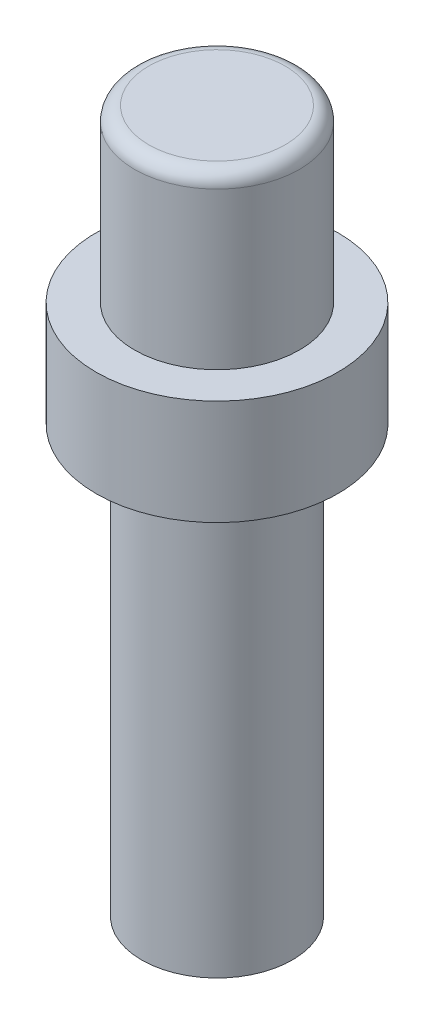
ISO-10303-21;
HEADER;
FILE_DESCRIPTION(('STEP AP214'),'2;1');
FILE_NAME('part.step','',(''),(''),'','','');
FILE_SCHEMA(('AUTOMOTIVE_DESIGN { 1 0 10303 214 1 1 1 1 }'));
ENDSEC;
DATA;
#1=APPLICATION_CONTEXT('core data for automotive mechanical design processes');
#2=APPLICATION_PROTOCOL_DEFINITION('international standard','automotive_design',2000,#1);
#3=PRODUCT_CONTEXT('',#1,'mechanical');
#4=PRODUCT('Part','Part','',(#3));
#5=PRODUCT_RELATED_PRODUCT_CATEGORY('part','',(#4));
#6=PRODUCT_DEFINITION_FORMATION('','',#4);
#7=PRODUCT_DEFINITION_CONTEXT('part definition',#1,'design');
#8=PRODUCT_DEFINITION('design','',#6,#7);
#9=PRODUCT_DEFINITION_SHAPE('','',#8);
#10=(LENGTH_UNIT() NAMED_UNIT(*) SI_UNIT(.MILLI.,.METRE.));
#11=(NAMED_UNIT(*) PLANE_ANGLE_UNIT() SI_UNIT($,.RADIAN.));
#12=(NAMED_UNIT(*) SI_UNIT($,.STERADIAN.) SOLID_ANGLE_UNIT());
#13=UNCERTAINTY_MEASURE_WITH_UNIT(LENGTH_MEASURE(1.E-05),#10,'distance_accuracy_value','');
#14=(GEOMETRIC_REPRESENTATION_CONTEXT(3) GLOBAL_UNCERTAINTY_ASSIGNED_CONTEXT((#13)) GLOBAL_UNIT_ASSIGNED_CONTEXT((#10,
#11,#12)) REPRESENTATION_CONTEXT('',''));
#15=CARTESIAN_POINT('',(0.,0.,0.));
#16=DIRECTION('',(0.,0.,1.));
#17=DIRECTION('',(1.,0.,0.));
#18=AXIS2_PLACEMENT_3D('',#15,#16,#17);
#19=CARTESIAN_POINT('',(0.,15.,0.));
#20=DIRECTION('',(0.,-1.,0.));
#21=DIRECTION('',(0.,0.,-1.));
#22=AXIS2_PLACEMENT_3D('',#19,#20,#21);
#23=CYLINDRICAL_SURFACE('',#22,2.65);
#24=CARTESIAN_POINT('',(0.,15.,0.));
#25=DIRECTION('',(0.,1.,0.));
#26=DIRECTION('',(0.,0.,1.));
#27=AXIS2_PLACEMENT_3D('',#24,#25,#26);
#28=CIRCLE('',#27,2.65);
#29=CARTESIAN_POINT('',(0.,15.,2.65));
#30=VERTEX_POINT('',#29);
#31=EDGE_CURVE('E46',#30,#30,#28,.T.);
#32=ORIENTED_EDGE('',*,*,#31,.F.);
#33=EDGE_LOOP('',(#32));
#34=FACE_BOUND('',#33,.T.);
#35=CARTESIAN_POINT('',(0.,0.,0.));
#36=DIRECTION('',(0.,1.,0.));
#37=DIRECTION('',(0.,0.,1.));
#38=AXIS2_PLACEMENT_3D('',#35,#36,#37);
#39=CIRCLE('',#38,2.65);
#40=CARTESIAN_POINT('',(0.,0.,2.65));
#41=VERTEX_POINT('',#40);
#42=EDGE_CURVE('E49',#41,#41,#39,.T.);
#43=ORIENTED_EDGE('',*,*,#42,.T.);
#44=EDGE_LOOP('',(#43));
#45=FACE_BOUND('',#44,.T.);
#46=ADVANCED_FACE('F31',(#34,#45),#23,.T.);
#47=CARTESIAN_POINT('',(0.,0.,0.));
#48=DIRECTION('',(0.,1.,0.));
#49=DIRECTION('',(0.,0.,1.));
#50=AXIS2_PLACEMENT_3D('',#47,#48,#49);
#51=PLANE('',#50);
#52=CARTESIAN_POINT('',(0.,0.,0.));
#53=DIRECTION('',(0.,-1.,0.));
#54=DIRECTION('',(0.,0.,-1.));
#55=AXIS2_PLACEMENT_3D('',#52,#53,#54);
#56=CIRCLE('',#55,1.15);
#57=CARTESIAN_POINT('',(0.,0.,-1.15));
#58=VERTEX_POINT('',#57);
#59=EDGE_CURVE('E55',#58,#58,#56,.T.);
#60=ORIENTED_EDGE('',*,*,#59,.F.);
#61=EDGE_LOOP('',(#60));
#62=FACE_BOUND('',#61,.T.);
#63=ORIENTED_EDGE('',*,*,#42,.F.);
#64=EDGE_LOOP('',(#63));
#65=FACE_BOUND('',#64,.T.);
#66=ADVANCED_FACE('F90',(#62,#65),#51,.F.);
#67=CARTESIAN_POINT('',(0.,12.,0.));
#68=DIRECTION('',(0.,-1.,0.));
#69=DIRECTION('',(0.,0.,-1.));
#70=AXIS2_PLACEMENT_3D('',#67,#68,#69);
#71=CYLINDRICAL_SURFACE('',#70,1.15);
#72=CARTESIAN_POINT('',(0.,12.,0.));
#73=DIRECTION('',(0.,-1.,0.));
#74=DIRECTION('',(0.,0.,-1.));
#75=AXIS2_PLACEMENT_3D('',#72,#73,#74);
#76=CIRCLE('',#75,1.15);
#77=CARTESIAN_POINT('',(0.,12.,-1.15));
#78=VERTEX_POINT('',#77);
#79=EDGE_CURVE('E52',#78,#78,#76,.T.);
#80=ORIENTED_EDGE('',*,*,#79,.F.);
#81=EDGE_LOOP('',(#80));
#82=FACE_BOUND('',#81,.T.);
#83=ORIENTED_EDGE('',*,*,#59,.T.);
#84=EDGE_LOOP('',(#83));
#85=FACE_BOUND('',#84,.T.);
#86=ADVANCED_FACE('F95',(#82,#85),#71,.F.);
#87=CARTESIAN_POINT('',(0.,12.,0.));
#88=DIRECTION('',(0.,-1.,0.));
#89=DIRECTION('',(0.,0.,-1.));
#90=AXIS2_PLACEMENT_3D('',#87,#88,#89);
#91=PLANE('',#90);
#92=ORIENTED_EDGE('',*,*,#79,.T.);
#93=EDGE_LOOP('',(#92));
#94=FACE_BOUND('',#93,.T.);
#95=ADVANCED_FACE('F72',(#94),#91,.T.);
#96=CARTESIAN_POINT('',(0.,18.7,0.));
#97=DIRECTION('',(0.,-1.,0.));
#98=DIRECTION('',(0.,0.,-1.));
#99=AXIS2_PLACEMENT_3D('',#96,#97,#98);
#100=CYLINDRICAL_SURFACE('',#99,4.25);
#101=CARTESIAN_POINT('',(0.,18.7,0.));
#102=DIRECTION('',(0.,1.,0.));
#103=DIRECTION('',(0.,0.,1.));
#104=AXIS2_PLACEMENT_3D('',#101,#102,#103);
#105=CIRCLE('',#104,4.25);
#106=CARTESIAN_POINT('',(0.,18.7,4.25));
#107=VERTEX_POINT('',#106);
#108=EDGE_CURVE('E58',#107,#107,#105,.T.);
#109=ORIENTED_EDGE('',*,*,#108,.F.);
#110=EDGE_LOOP('',(#109));
#111=FACE_BOUND('',#110,.T.);
#112=CARTESIAN_POINT('',(0.,15.,0.));
#113=DIRECTION('',(0.,1.,0.));
#114=DIRECTION('',(0.,0.,1.));
#115=AXIS2_PLACEMENT_3D('',#112,#113,#114);
#116=CIRCLE('',#115,4.25);
#117=CARTESIAN_POINT('',(0.,15.,4.25));
#118=VERTEX_POINT('',#117);
#119=EDGE_CURVE('E61',#118,#118,#116,.T.);
#120=ORIENTED_EDGE('',*,*,#119,.T.);
#121=EDGE_LOOP('',(#120));
#122=FACE_BOUND('',#121,.T.);
#123=ADVANCED_FACE('F69',(#111,#122),#100,.T.);
#124=CARTESIAN_POINT('',(0.,18.7,0.));
#125=DIRECTION('',(0.,1.,0.));
#126=DIRECTION('',(0.,0.,1.));
#127=AXIS2_PLACEMENT_3D('',#124,#125,#126);
#128=PLANE('',#127);
#129=CARTESIAN_POINT('',(0.,18.7,0.));
#130=DIRECTION('',(0.,1.,0.));
#131=DIRECTION('',(0.,0.,1.));
#132=AXIS2_PLACEMENT_3D('',#129,#130,#131);
#133=CIRCLE('',#132,2.9);
#134=CARTESIAN_POINT('',(0.,18.7,2.9));
#135=VERTEX_POINT('',#134);
#136=EDGE_CURVE('E42',#135,#135,#133,.T.);
#137=ORIENTED_EDGE('',*,*,#136,.F.);
#138=EDGE_LOOP('',(#137));
#139=FACE_BOUND('',#138,.T.);
#140=ORIENTED_EDGE('',*,*,#108,.T.);
#141=EDGE_LOOP('',(#140));
#142=FACE_BOUND('',#141,.T.);
#143=ADVANCED_FACE('F67',(#139,#142),#128,.T.);
#144=CARTESIAN_POINT('',(0.,15.,0.));
#145=DIRECTION('',(0.,1.,0.));
#146=DIRECTION('',(0.,0.,1.));
#147=AXIS2_PLACEMENT_3D('',#144,#145,#146);
#148=PLANE('',#147);
#149=ORIENTED_EDGE('',*,*,#31,.T.);
#150=EDGE_LOOP('',(#149));
#151=FACE_BOUND('',#150,.T.);
#152=ORIENTED_EDGE('',*,*,#119,.F.);
#153=EDGE_LOOP('',(#152));
#154=FACE_BOUND('',#153,.T.);
#155=ADVANCED_FACE('F76',(#151,#154),#148,.F.);
#156=CARTESIAN_POINT('',(0.,24.7,0.));
#157=DIRECTION('',(0.,-1.,0.));
#158=DIRECTION('',(0.,0.,-1.));
#159=AXIS2_PLACEMENT_3D('',#156,#157,#158);
#160=CYLINDRICAL_SURFACE('',#159,2.9);
#161=CARTESIAN_POINT('',(0.,24.2,0.));
#162=DIRECTION('',(0.,1.,0.));
#163=DIRECTION('',(0.,0.,1.));
#164=AXIS2_PLACEMENT_3D('',#161,#162,#163);
#165=CIRCLE('',#164,2.9);
#166=CARTESIAN_POINT('',(0.,24.2,2.9));
#167=VERTEX_POINT('',#166);
#168=EDGE_CURVE('E10',#167,#167,#165,.F.);
#169=ORIENTED_EDGE('',*,*,#168,.T.);
#170=EDGE_LOOP('',(#169));
#171=FACE_BOUND('',#170,.T.);
#172=ORIENTED_EDGE('',*,*,#136,.T.);
#173=EDGE_LOOP('',(#172));
#174=FACE_BOUND('',#173,.T.);
#175=ADVANCED_FACE('F78',(#171,#174),#160,.T.);
#176=CARTESIAN_POINT('',(0.,24.7,0.));
#177=DIRECTION('',(0.,1.,0.));
#178=DIRECTION('',(0.,0.,1.));
#179=AXIS2_PLACEMENT_3D('',#176,#177,#178);
#180=PLANE('',#179);
#181=CARTESIAN_POINT('',(0.,24.7,0.));
#182=DIRECTION('',(0.,1.,0.));
#183=DIRECTION('',(0.,0.,1.));
#184=AXIS2_PLACEMENT_3D('',#181,#182,#183);
#185=CIRCLE('',#184,2.4);
#186=CARTESIAN_POINT('',(0.,24.7,2.4));
#187=VERTEX_POINT('',#186);
#188=EDGE_CURVE('E38',#187,#187,#185,.T.);
#189=ORIENTED_EDGE('',*,*,#188,.T.);
#190=EDGE_LOOP('',(#189));
#191=FACE_BOUND('',#190,.T.);
#192=ADVANCED_FACE('F85',(#191),#180,.T.);
#193=CARTESIAN_POINT('',(0.,24.2,0.));
#194=DIRECTION('',(0.,1.,0.));
#195=DIRECTION('',(0.,0.,1.));
#196=AXIS2_PLACEMENT_3D('',#193,#194,#195);
#197=TOROIDAL_SURFACE('',#196,2.4,0.5);
#198=ORIENTED_EDGE('',*,*,#168,.F.);
#199=EDGE_LOOP('',(#198));
#200=FACE_BOUND('',#199,.T.);
#201=ORIENTED_EDGE('',*,*,#188,.F.);
#202=EDGE_LOOP('',(#201));
#203=FACE_BOUND('',#202,.T.);
#204=ADVANCED_FACE('F33',(#200,#203),#197,.T.);
#205=CLOSED_SHELL('',(#46,#66,#86,#95,#123,#143,#155,#175,#192,#204));
#206=MANIFOLD_SOLID_BREP('B2',#205);
#207=ADVANCED_BREP_SHAPE_REPRESENTATION('',(#18,#206),#14);
#208=SHAPE_DEFINITION_REPRESENTATION(#9,#207);
ENDSEC;
END-ISO-10303-21;
